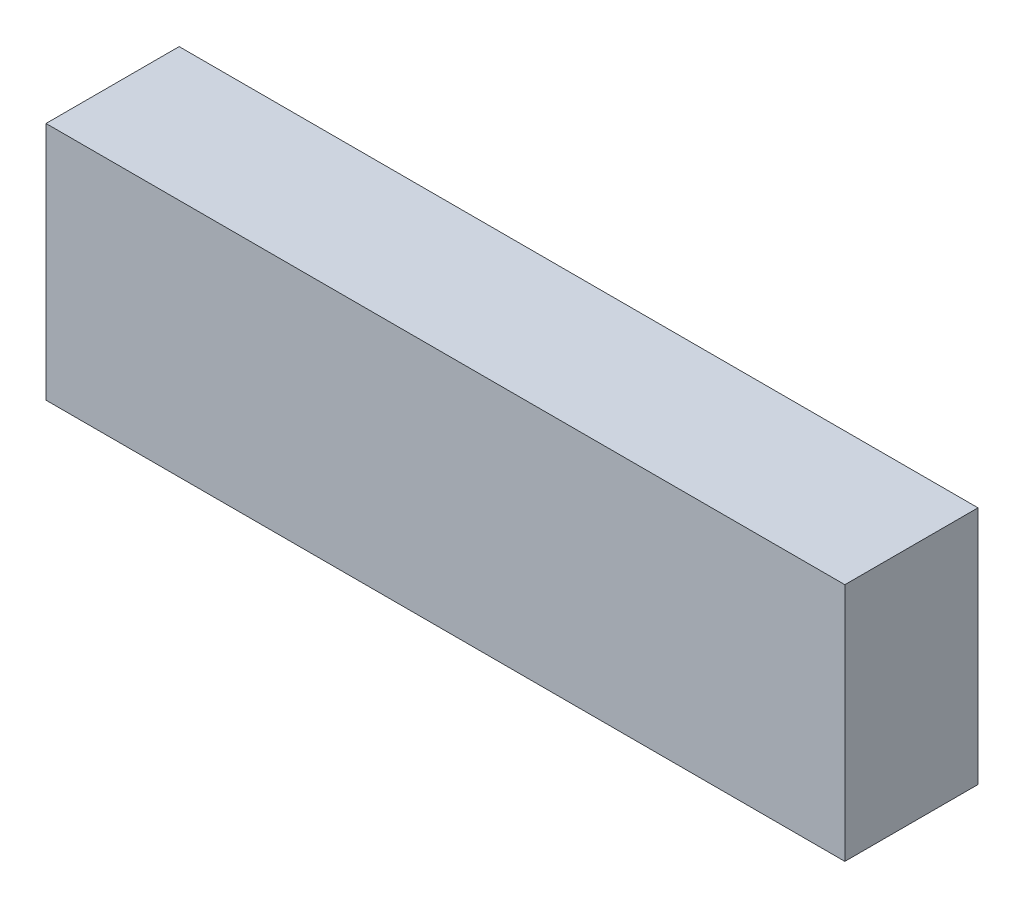
ISO-10303-21;
HEADER;
FILE_DESCRIPTION(('STEP AP214'),'2;1');
FILE_NAME('part.step','',(''),(''),'','','');
FILE_SCHEMA(('AUTOMOTIVE_DESIGN { 1 0 10303 214 1 1 1 1 }'));
ENDSEC;
DATA;
#1=APPLICATION_CONTEXT('core data for automotive mechanical design processes');
#2=APPLICATION_PROTOCOL_DEFINITION('international standard','automotive_design',2000,#1);
#3=PRODUCT_CONTEXT('',#1,'mechanical');
#4=PRODUCT('Part','Part','',(#3));
#5=PRODUCT_RELATED_PRODUCT_CATEGORY('part','',(#4));
#6=PRODUCT_DEFINITION_FORMATION('','',#4);
#7=PRODUCT_DEFINITION_CONTEXT('part definition',#1,'design');
#8=PRODUCT_DEFINITION('design','',#6,#7);
#9=PRODUCT_DEFINITION_SHAPE('','',#8);
#10=(LENGTH_UNIT() NAMED_UNIT(*) SI_UNIT(.MILLI.,.METRE.));
#11=(NAMED_UNIT(*) PLANE_ANGLE_UNIT() SI_UNIT($,.RADIAN.));
#12=(NAMED_UNIT(*) SI_UNIT($,.STERADIAN.) SOLID_ANGLE_UNIT());
#13=UNCERTAINTY_MEASURE_WITH_UNIT(LENGTH_MEASURE(1.E-05),#10,'distance_accuracy_value','');
#14=(GEOMETRIC_REPRESENTATION_CONTEXT(3) GLOBAL_UNCERTAINTY_ASSIGNED_CONTEXT((#13)) GLOBAL_UNIT_ASSIGNED_CONTEXT((#10,
#11,#12)) REPRESENTATION_CONTEXT('',''));
#15=CARTESIAN_POINT('',(0.,0.,0.));
#16=DIRECTION('',(0.,0.,1.));
#17=DIRECTION('',(1.,0.,0.));
#18=AXIS2_PLACEMENT_3D('',#15,#16,#17);
#19=CARTESIAN_POINT('',(-75.6361607142857,48.0133928571429,30.));
#20=DIRECTION('',(1.,0.,0.));
#21=DIRECTION('',(0.,1.,0.));
#22=AXIS2_PLACEMENT_3D('',#19,#20,#21);
#23=PLANE('',#22);
#24=DIRECTION('',(0.,-1.,0.));
#25=VECTOR('',#24,1.);
#26=CARTESIAN_POINT('',(-75.6361607142857,48.0133928571429,0.));
#27=LINE('',#26,#25);
#28=CARTESIAN_POINT('',(-75.6361607142857,48.0133928571429,0.));
#29=VERTEX_POINT('',#28);
#30=CARTESIAN_POINT('',(-75.6361607142857,-5.98660714285714,0.));
#31=VERTEX_POINT('',#30);
#32=EDGE_CURVE('E97',#29,#31,#27,.T.);
#33=ORIENTED_EDGE('',*,*,#32,.T.);
#34=DIRECTION('',(0.,0.,-1.));
#35=VECTOR('',#34,1.);
#36=CARTESIAN_POINT('',(-75.6361607142857,-5.98660714285714,30.));
#37=LINE('',#36,#35);
#38=CARTESIAN_POINT('',(-75.6361607142857,-5.98660714285714,30.));
#39=VERTEX_POINT('',#38);
#40=EDGE_CURVE('E11',#39,#31,#37,.T.);
#41=ORIENTED_EDGE('',*,*,#40,.F.);
#42=DIRECTION('',(0.,-1.,0.));
#43=VECTOR('',#42,1.);
#44=CARTESIAN_POINT('',(-75.6361607142857,48.0133928571429,30.));
#45=LINE('',#44,#43);
#46=CARTESIAN_POINT('',(-75.6361607142857,48.0133928571429,30.));
#47=VERTEX_POINT('',#46);
#48=EDGE_CURVE('E85',#47,#39,#45,.T.);
#49=ORIENTED_EDGE('',*,*,#48,.F.);
#50=DIRECTION('',(0.,0.,-1.));
#51=VECTOR('',#50,1.);
#52=CARTESIAN_POINT('',(-75.6361607142857,48.0133928571429,30.));
#53=LINE('',#52,#51);
#54=EDGE_CURVE('E93',#47,#29,#53,.T.);
#55=ORIENTED_EDGE('',*,*,#54,.T.);
#56=EDGE_LOOP('',(#33,#41,#49,#55));
#57=FACE_BOUND('',#56,.T.);
#58=ADVANCED_FACE('F34',(#57),#23,.F.);
#59=CARTESIAN_POINT('',(-75.6361607142857,-5.98660714285714,30.));
#60=DIRECTION('',(0.,1.,0.));
#61=DIRECTION('',(0.,0.,1.));
#62=AXIS2_PLACEMENT_3D('',#59,#60,#61);
#63=PLANE('',#62);
#64=DIRECTION('',(1.,0.,0.));
#65=VECTOR('',#64,1.);
#66=CARTESIAN_POINT('',(-75.6361607142857,-5.98660714285714,0.));
#67=LINE('',#66,#65);
#68=CARTESIAN_POINT('',(104.363839285714,-5.98660714285714,0.));
#69=VERTEX_POINT('',#68);
#70=EDGE_CURVE('E89',#31,#69,#67,.T.);
#71=ORIENTED_EDGE('',*,*,#70,.T.);
#72=DIRECTION('',(0.,0.,-1.));
#73=VECTOR('',#72,1.);
#74=CARTESIAN_POINT('',(104.363839285714,-5.98660714285714,30.));
#75=LINE('',#74,#73);
#76=CARTESIAN_POINT('',(104.363839285714,-5.98660714285714,30.));
#77=VERTEX_POINT('',#76);
#78=EDGE_CURVE('E42',#77,#69,#75,.T.);
#79=ORIENTED_EDGE('',*,*,#78,.F.);
#80=DIRECTION('',(1.,0.,0.));
#81=VECTOR('',#80,1.);
#82=CARTESIAN_POINT('',(-75.6361607142857,-5.98660714285714,30.));
#83=LINE('',#82,#81);
#84=EDGE_CURVE('E80',#39,#77,#83,.T.);
#85=ORIENTED_EDGE('',*,*,#84,.F.);
#86=ORIENTED_EDGE('',*,*,#40,.T.);
#87=EDGE_LOOP('',(#71,#79,#85,#86));
#88=FACE_BOUND('',#87,.T.);
#89=ADVANCED_FACE('F88',(#88),#63,.F.);
#90=CARTESIAN_POINT('',(104.363839285714,48.0133928571429,30.));
#91=DIRECTION('',(-1.,0.,0.));
#92=DIRECTION('',(0.,-1.,0.));
#93=AXIS2_PLACEMENT_3D('',#90,#91,#92);
#94=PLANE('',#93);
#95=DIRECTION('',(0.,1.,0.));
#96=VECTOR('',#95,1.);
#97=CARTESIAN_POINT('',(104.363839285714,48.0133928571429,0.));
#98=LINE('',#97,#96);
#99=CARTESIAN_POINT('',(104.363839285714,48.0133928571429,0.));
#100=VERTEX_POINT('',#99);
#101=EDGE_CURVE('E67',#69,#100,#98,.T.);
#102=ORIENTED_EDGE('',*,*,#101,.T.);
#103=DIRECTION('',(0.,0.,-1.));
#104=VECTOR('',#103,1.);
#105=CARTESIAN_POINT('',(104.363839285714,48.0133928571429,30.));
#106=LINE('',#105,#104);
#107=CARTESIAN_POINT('',(104.363839285714,48.0133928571429,30.));
#108=VERTEX_POINT('',#107);
#109=EDGE_CURVE('E90',#108,#100,#106,.T.);
#110=ORIENTED_EDGE('',*,*,#109,.F.);
#111=DIRECTION('',(0.,1.,0.));
#112=VECTOR('',#111,1.);
#113=CARTESIAN_POINT('',(104.363839285714,48.0133928571429,30.));
#114=LINE('',#113,#112);
#115=EDGE_CURVE('E83',#77,#108,#114,.T.);
#116=ORIENTED_EDGE('',*,*,#115,.F.);
#117=ORIENTED_EDGE('',*,*,#78,.T.);
#118=EDGE_LOOP('',(#102,#110,#116,#117));
#119=FACE_BOUND('',#118,.T.);
#120=ADVANCED_FACE('F91',(#119),#94,.F.);
#121=CARTESIAN_POINT('',(-75.6361607142857,48.0133928571429,30.));
#122=DIRECTION('',(0.,-1.,0.));
#123=DIRECTION('',(0.,0.,-1.));
#124=AXIS2_PLACEMENT_3D('',#121,#122,#123);
#125=PLANE('',#124);
#126=DIRECTION('',(-1.,0.,0.));
#127=VECTOR('',#126,1.);
#128=CARTESIAN_POINT('',(-75.6361607142857,48.0133928571429,0.));
#129=LINE('',#128,#127);
#130=EDGE_CURVE('E73',#100,#29,#129,.T.);
#131=ORIENTED_EDGE('',*,*,#130,.T.);
#132=ORIENTED_EDGE('',*,*,#54,.F.);
#133=DIRECTION('',(-1.,0.,0.));
#134=VECTOR('',#133,1.);
#135=CARTESIAN_POINT('',(-75.6361607142857,48.0133928571429,30.));
#136=LINE('',#135,#134);
#137=EDGE_CURVE('E50',#108,#47,#136,.T.);
#138=ORIENTED_EDGE('',*,*,#137,.F.);
#139=ORIENTED_EDGE('',*,*,#109,.T.);
#140=EDGE_LOOP('',(#131,#132,#138,#139));
#141=FACE_BOUND('',#140,.T.);
#142=ADVANCED_FACE('F104',(#141),#125,.F.);
#143=CARTESIAN_POINT('',(0.,0.,30.));
#144=DIRECTION('',(0.,0.,1.));
#145=DIRECTION('',(1.,0.,0.));
#146=AXIS2_PLACEMENT_3D('',#143,#144,#145);
#147=PLANE('',#146);
#148=ORIENTED_EDGE('',*,*,#48,.T.);
#149=ORIENTED_EDGE('',*,*,#84,.T.);
#150=ORIENTED_EDGE('',*,*,#115,.T.);
#151=ORIENTED_EDGE('',*,*,#137,.T.);
#152=EDGE_LOOP('',(#148,#149,#150,#151));
#153=FACE_BOUND('',#152,.T.);
#154=ADVANCED_FACE('F81',(#153),#147,.T.);
#155=CARTESIAN_POINT('',(0.,0.,0.));
#156=DIRECTION('',(0.,0.,1.));
#157=DIRECTION('',(1.,0.,0.));
#158=AXIS2_PLACEMENT_3D('',#155,#156,#157);
#159=PLANE('',#158);
#160=ORIENTED_EDGE('',*,*,#32,.F.);
#161=ORIENTED_EDGE('',*,*,#130,.F.);
#162=ORIENTED_EDGE('',*,*,#101,.F.);
#163=ORIENTED_EDGE('',*,*,#70,.F.);
#164=EDGE_LOOP('',(#160,#161,#162,#163));
#165=FACE_BOUND('',#164,.T.);
#166=ADVANCED_FACE('F107',(#165),#159,.F.);
#167=CLOSED_SHELL('',(#58,#89,#120,#142,#154,#166));
#168=MANIFOLD_SOLID_BREP('B2',#167);
#169=ADVANCED_BREP_SHAPE_REPRESENTATION('',(#18,#168),#14);
#170=SHAPE_DEFINITION_REPRESENTATION(#9,#169);
ENDSEC;
END-ISO-10303-21;
